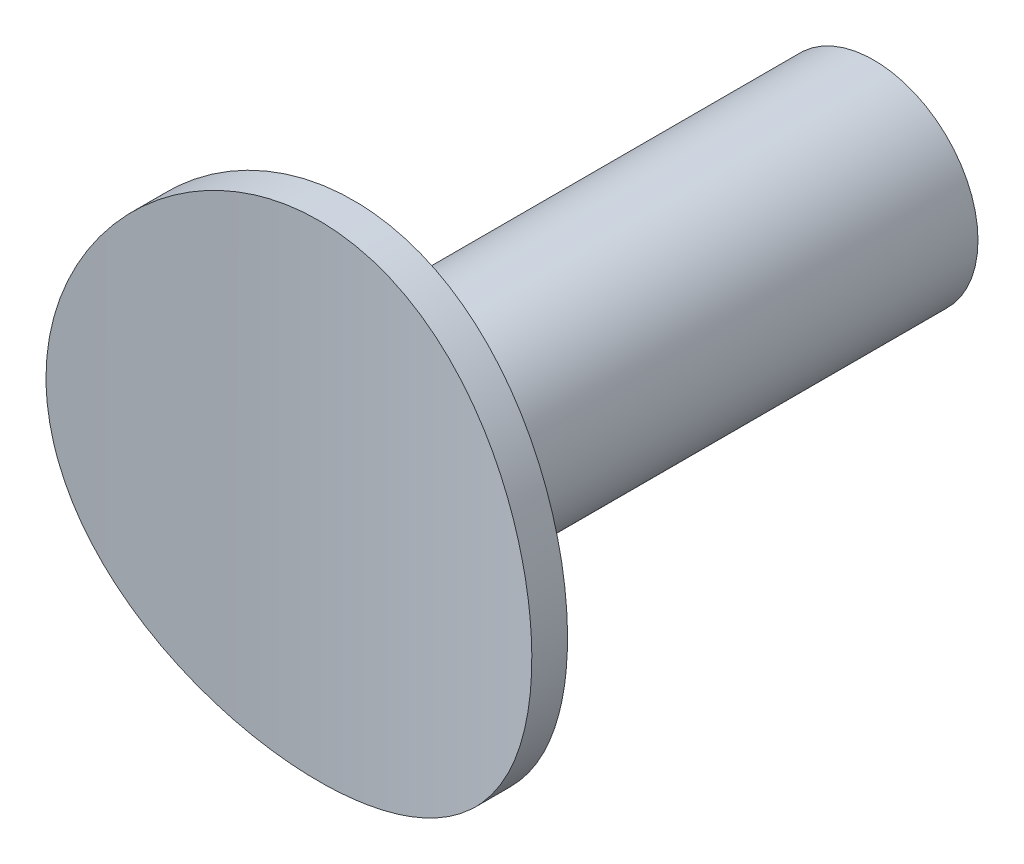
ISO-10303-21;
HEADER;
FILE_DESCRIPTION(('STEP AP214'),'2;1');
FILE_NAME('part.step','',(''),(''),'','','');
FILE_SCHEMA(('AUTOMOTIVE_DESIGN { 1 0 10303 214 1 1 1 1 }'));
ENDSEC;
DATA;
#1=APPLICATION_CONTEXT('core data for automotive mechanical design processes');
#2=APPLICATION_PROTOCOL_DEFINITION('international standard','automotive_design',2000,#1);
#3=PRODUCT_CONTEXT('',#1,'mechanical');
#4=PRODUCT('Part','Part','',(#3));
#5=PRODUCT_RELATED_PRODUCT_CATEGORY('part','',(#4));
#6=PRODUCT_DEFINITION_FORMATION('','',#4);
#7=PRODUCT_DEFINITION_CONTEXT('part definition',#1,'design');
#8=PRODUCT_DEFINITION('design','',#6,#7);
#9=PRODUCT_DEFINITION_SHAPE('','',#8);
#10=(LENGTH_UNIT() NAMED_UNIT(*) SI_UNIT(.MILLI.,.METRE.));
#11=(NAMED_UNIT(*) PLANE_ANGLE_UNIT() SI_UNIT($,.RADIAN.));
#12=(NAMED_UNIT(*) SI_UNIT($,.STERADIAN.) SOLID_ANGLE_UNIT());
#13=UNCERTAINTY_MEASURE_WITH_UNIT(LENGTH_MEASURE(1.E-05),#10,'distance_accuracy_value','');
#14=(GEOMETRIC_REPRESENTATION_CONTEXT(3) GLOBAL_UNCERTAINTY_ASSIGNED_CONTEXT((#13)) GLOBAL_UNIT_ASSIGNED_CONTEXT((#10,
#11,#12)) REPRESENTATION_CONTEXT('',''));
#15=CARTESIAN_POINT('',(0.,0.,0.));
#16=DIRECTION('',(0.,0.,1.));
#17=DIRECTION('',(1.,0.,0.));
#18=AXIS2_PLACEMENT_3D('',#15,#16,#17);
#19=CARTESIAN_POINT('',(0.,0.,5.));
#20=DIRECTION('',(0.,0.,-1.));
#21=DIRECTION('',(-1.,0.,0.));
#22=AXIS2_PLACEMENT_3D('',#19,#20,#21);
#23=CYLINDRICAL_SURFACE('',#22,3.5);
#24=CARTESIAN_POINT('',(-3.5,0.,0.41404785418518));
#25=CARTESIAN_POINT('',(-3.49999382242972,-0.193703175243394,0.414043982129636));
#26=CARTESIAN_POINT('',(-3.48386486905519,-0.387477829788261,0.410147172153116));
#27=CARTESIAN_POINT('',(-3.41986023845863,-0.769492219654667,0.3950145924914));
#28=CARTESIAN_POINT('',(-3.37196364396502,-0.957728222730468,0.38377398738779));
#29=CARTESIAN_POINT('',(-3.24603407819027,-1.32308439711535,0.35529461552767));
#30=CARTESIAN_POINT('',(-3.16803679347527,-1.50021744380222,0.338062953994301));
#31=CARTESIAN_POINT('',(-2.98422520148826,-1.83889506487007,0.299551714595636));
#32=CARTESIAN_POINT('',(-2.87841066441535,-2.00043951045709,0.278272103290254));
#33=CARTESIAN_POINT('',(-2.63980106057307,-2.30645615781757,0.23360584171042));
#34=CARTESIAN_POINT('',(-2.5065715318374,-2.45058527508346,0.210189145596052));
#35=CARTESIAN_POINT('',(-2.21785084526522,-2.71466720697627,0.164149119889418));
#36=CARTESIAN_POINT('',(-2.06235780629929,-2.83461797661763,0.141525857538709));
#37=CARTESIAN_POINT('',(-1.73120086211389,-3.04831649272867,0.0992921045962102));
#38=CARTESIAN_POINT('',(-1.55531645782126,-3.14173104353059,0.0797212067824029));
#39=CARTESIAN_POINT('',(-1.18981102664572,-3.29754493265482,0.0461382178763421));
#40=CARTESIAN_POINT('',(-1.00019176216939,-3.35994824217594,0.0321254150789096));
#41=CARTESIAN_POINT('',(-0.616171057371638,-3.45088017519229,0.0114498389382332));
#42=CARTESIAN_POINT('',(-0.421914232090605,-3.47999038454816,0.00466102373046354));
#43=CARTESIAN_POINT('',(-0.0311635768581278,-3.50533140486736,-0.00123950369547249));
#44=CARTESIAN_POINT('',(0.165329960094939,-3.50156647392213,-0.000352210147496445));
#45=CARTESIAN_POINT('',(0.550956085082925,-3.46169054018308,0.00890430562141952));
#46=CARTESIAN_POINT('',(0.740157536209716,-3.42620679922486,0.0171284305545406));
#47=CARTESIAN_POINT('',(1.10984337835129,-3.32490396988305,0.0399676250616005));
#48=CARTESIAN_POINT('',(1.29032734098614,-3.25908339241059,0.0545830083497573));
#49=CARTESIAN_POINT('',(1.63915602843674,-3.09844204447942,0.0887907638637174));
#50=CARTESIAN_POINT('',(1.80739027310239,-3.0033901148032,0.108422588551156));
#51=CARTESIAN_POINT('',(2.12574510859739,-2.78715787938144,0.1505208382788));
#52=CARTESIAN_POINT('',(2.27586291268992,-2.66597356182649,0.17298769832993));
#53=CARTESIAN_POINT('',(2.55745955163835,-2.3975246703536,0.218922079024754));
#54=CARTESIAN_POINT('',(2.68841397339774,-2.24971136633832,0.242400699940919));
#55=CARTESIAN_POINT('',(2.9237828774077,-1.93397678024096,0.287220162264489));
#56=CARTESIAN_POINT('',(3.02819642430487,-1.76605478979535,0.308560928313567));
#57=CARTESIAN_POINT('',(3.20779820165087,-1.41394072993024,0.346722827487907));
#58=CARTESIAN_POINT('',(3.2828751789352,-1.22968991412938,0.363526682268938));
#59=CARTESIAN_POINT('',(3.40083499129253,-0.850699079901447,0.390481823953275));
#60=CARTESIAN_POINT('',(3.44372372349243,-0.655960989831458,0.400634329390127));
#61=CARTESIAN_POINT('',(3.49525081184908,-0.266347711845827,0.412885367717083));
#62=CARTESIAN_POINT('',(3.50465806822764,-0.0715797756669479,0.415164671488916));
#63=CARTESIAN_POINT('',(3.49104744238815,0.316741782572008,0.411900878770518));
#64=CARTESIAN_POINT('',(3.46803212363167,0.510295499417961,0.406358400702331));
#65=CARTESIAN_POINT('',(3.39090009352541,0.88793757381852,0.388247405884228));
#66=CARTESIAN_POINT('',(3.33721769411786,1.07211978765985,0.375777069037391));
#67=CARTESIAN_POINT('',(3.20075064839175,1.42887400571391,0.345306113698783));
#68=CARTESIAN_POINT('',(3.11796290841877,1.60144477340299,0.327304907347463));
#69=CARTESIAN_POINT('',(2.92397968889597,1.93337355364668,0.287410828560261));
#70=CARTESIAN_POINT('',(2.81231684244289,2.09245081803794,0.265455929516374));
#71=CARTESIAN_POINT('',(2.56435525461255,2.38989200280703,0.220286547025187));
#72=CARTESIAN_POINT('',(2.42805300928301,2.52825297201143,0.197071884756828));
#73=CARTESIAN_POINT('',(2.13117978140588,2.78337703063407,0.151395192675249));
#74=CARTESIAN_POINT('',(1.97015041019719,2.89961238200704,0.128960038978583));
#75=CARTESIAN_POINT('',(1.63040748924498,3.10338543687699,0.0878906509418267));
#76=CARTESIAN_POINT('',(1.45169481920304,3.19092456700849,0.0692562276655821));
#77=CARTESIAN_POINT('',(1.0828393129744,3.33411479680315,0.0379998565010875));
#78=CARTESIAN_POINT('',(0.892784039390126,3.38998216657693,0.0253372327229985));
#79=CARTESIAN_POINT('',(0.505652963162882,3.46890797358145,0.00727425966111515));
#80=CARTESIAN_POINT('',(0.308578336126193,3.49197187852105,0.00187270010531618));
#81=CARTESIAN_POINT('',(-0.0820115860349006,3.504362084857,-0.00101749677922848));
#82=CARTESIAN_POINT('',(-0.275501067194068,3.4944720408113,0.00131006070559404));
#83=CARTESIAN_POINT('',(-0.657979203055063,3.44300693826575,0.0132165465634454));
#84=CARTESIAN_POINT('',(-0.846967961271833,3.40143260921981,0.0227953079950379));
#85=CARTESIAN_POINT('',(-1.21437646370029,3.28817572935145,0.0481074875871416));
#86=CARTESIAN_POINT('',(-1.39283664433181,3.21661826826587,0.0638153167425139));
#87=CARTESIAN_POINT('',(-1.73531470417867,3.04554343063893,0.0997192565707047));
#88=CARTESIAN_POINT('',(-1.89933097923893,2.94602295362676,0.11991586489645));
#89=CARTESIAN_POINT('',(-2.21204108372942,2.71936637824269,0.163142299014843));
#90=CARTESIAN_POINT('',(-2.3603346174186,2.59168772678443,0.186223266444465));
#91=CARTESIAN_POINT('',(-2.63365825928883,2.31341524362604,0.232363055875124));
#92=CARTESIAN_POINT('',(-2.75868263628052,2.16281578309344,0.255421871032461));
#93=CARTESIAN_POINT('',(-2.98382614360097,1.84013342099422,0.29931370106953));
#94=CARTESIAN_POINT('',(-3.08352384318794,1.66775058251451,0.320106127927998));
#95=CARTESIAN_POINT('',(-3.25237429886375,1.30821897658358,0.356585828158854));
#96=CARTESIAN_POINT('',(-3.32155129875168,1.12108206866762,0.37227715092297));
#97=CARTESIAN_POINT('',(-3.41596104650187,0.778312499116097,0.394076526855135));
#98=CARTESIAN_POINT('',(-3.44741160495044,0.624446939336433,0.401513150936484));
#99=CARTESIAN_POINT('',(-3.4894329209735,0.313736424177428,0.411500227666915));
#100=CARTESIAN_POINT('',(-3.50000500357955,0.15689165850828,0.414050990391984));
#101=CARTESIAN_POINT('',(-3.5,0.,0.41404785418518));
#102=B_SPLINE_CURVE_WITH_KNOTS('',3,(#24,#25,#26,#27,#28,#29,#30,#31,#32,#33,#34,#35,#36,#37,
#38,#39,#40,#41,#42,#43,#44,#45,#46,#47,#48,#49,#50,#51,#52,#53,#54,#55,#56,#57,#58,#59,#60,#61,
#62,#63,#64,#65,#66,#67,#68,#69,#70,#71,#72,#73,#74,#75,#76,#77,#78,#79,#80,#81,#82,#83,#84,#85,
#86,#87,#88,#89,#90,#91,#92,#93,#94,#95,#96,#97,#98,#99,#100,#101),.UNSPECIFIED.,.T.,.F.,(4,2,2,
2,2,2,2,2,2,2,2,2,2,2,2,2,2,2,2,2,2,2,2,2,2,2,2,2,2,2,2,2,2,2,2,2,2,2,4),(0.,0.580534028047367,
1.16145068630173,1.7416807308075,2.32191556879798,2.91217274679719,3.50247982735418,
4.09990075926493,4.69724516766548,5.28398725759893,5.87065335198108,6.44596825784345,
7.02131140614541,7.6013267010958,8.18143110269398,8.7752467963137,9.36908341428311,
9.96515067766247,10.5611087103916,11.1432889870275,11.7254232366897,12.2995106495196,
12.873659101501,13.457755844909,14.0419357177594,14.6386632899224,15.2353611912345,
15.8279338940698,16.4204078148129,16.9988940378553,17.5773669430563,18.1534501158965,
18.7295971886526,19.3180036695811,19.9065548836924,20.5043382085165,21.1016458317047,
21.5718845218039,22.0420933677167),.UNSPECIFIED.);
#103=CARTESIAN_POINT('',(-3.5,0.,0.41404785418518));
#104=VERTEX_POINT('',#103);
#105=EDGE_CURVE('E48',#104,#104,#102,.T.);
#106=ORIENTED_EDGE('',*,*,#105,.T.);
#107=EDGE_LOOP('',(#106));
#108=FACE_BOUND('',#107,.T.);
#109=CARTESIAN_POINT('',(-3.5,0.,0.928752720529712));
#110=CARTESIAN_POINT('',(-3.49999413694145,0.193498421710932,0.928748918188319));
#111=CARTESIAN_POINT('',(-3.48389894229743,0.387063246154586,0.924717872371037));
#112=CARTESIAN_POINT('',(-3.42003668396971,0.768649918290121,0.909067031868162));
#113=CARTESIAN_POINT('',(-3.37224991312957,0.95666824089992,0.897442515310323));
#114=CARTESIAN_POINT('',(-3.24662852060923,1.3215873063297,0.867996245675417));
#115=CARTESIAN_POINT('',(-3.16883099860247,1.49850146352165,0.8501821469279));
#116=CARTESIAN_POINT('',(-2.98550768701878,1.8367819342362,0.810373339348634));
#117=CARTESIAN_POINT('',(-2.87998121480662,1.99814786485666,0.788378527599185));
#118=CARTESIAN_POINT('',(-2.64188298014033,2.3040641608245,0.742181377447717));
#119=CARTESIAN_POINT('',(-2.5088472260194,2.44824843694406,0.717945741366869));
#120=CARTESIAN_POINT('',(-2.22050691723983,2.71248885421881,0.670287284339465));
#121=CARTESIAN_POINT('',(-2.06520038869463,2.83254285440992,0.646864535668927));
#122=CARTESIAN_POINT('',(-1.73423435730235,3.04659839036825,0.603104176056988));
#123=CARTESIAN_POINT('',(-1.5583373409135,3.14024243511929,0.582810442948704));
#124=CARTESIAN_POINT('',(-1.19272833877705,3.29649879239701,0.547973467096956));
#125=CARTESIAN_POINT('',(-1.00301825339325,3.35911536438024,0.533429435089039));
#126=CARTESIAN_POINT('',(-0.618982166671364,3.45037278765043,0.511965945849957));
#127=CARTESIAN_POINT('',(-0.42481167309159,3.47963475423051,0.504907279184238));
#128=CARTESIAN_POINT('',(-0.034197977416351,3.50529975825923,0.498725532026864));
#129=CARTESIAN_POINT('',(0.162244906812022,3.50170733724525,0.499601354732381));
#130=CARTESIAN_POINT('',(0.547526837878682,3.46221684477034,0.509085479165884));
#131=CARTESIAN_POINT('',(0.73643911228541,3.42698892001993,0.517533371918848));
#132=CARTESIAN_POINT('',(1.10558776040644,3.32630190749381,0.541026840005663));
#133=CARTESIAN_POINT('',(1.28582369000925,3.26084127402539,0.556072752671224));
#134=CARTESIAN_POINT('',(1.63429615823629,3.10099044603332,0.591320730184213));
#135=CARTESIAN_POINT('',(1.80241672841903,3.00635732414394,0.611565844526481));
#136=CARTESIAN_POINT('',(2.12062893064901,2.79103111903333,0.655009145976016));
#137=CARTESIAN_POINT('',(2.27071761180542,2.67033377945941,0.678207815152002));
#138=CARTESIAN_POINT('',(2.55259968378838,2.40269623162053,0.725715100536893));
#139=CARTESIAN_POINT('',(2.68383504384309,2.25517004423965,0.750036951388395));
#140=CARTESIAN_POINT('',(2.91982220763147,1.93994919220983,0.796509384348165));
#141=CARTESIAN_POINT('',(3.02457293939139,1.77225371160762,0.818659878547872));
#142=CARTESIAN_POINT('',(3.20494237115899,1.4204159577292,0.858325813269879));
#143=CARTESIAN_POINT('',(3.28043514544128,1.23620670325527,0.875821118969236));
#144=CARTESIAN_POINT('',(3.39921258452892,0.857189152909004,0.903932491257948));
#145=CARTESIAN_POINT('',(3.44250361582305,0.662382960295905,0.914549917594037));
#146=CARTESIAN_POINT('',(3.49474040218257,0.272854632622547,0.927420223051927));
#147=CARTESIAN_POINT('',(3.50450761687567,0.078249135252938,0.9298731175915));
#148=CARTESIAN_POINT('',(3.49166128716305,-0.309810503373919,0.926679675887842));
#149=CARTESIAN_POINT('',(3.46905050058773,-0.503264741281617,0.921034029446306));
#150=CARTESIAN_POINT('',(3.39280820009506,-0.880535563121871,0.902470509484665));
#151=CARTESIAN_POINT('',(3.3396474281972,-1.06445322620614,0.889663070323313));
#152=CARTESIAN_POINT('',(3.20433255960174,-1.42076827733734,0.858322382768752));
#153=CARTESIAN_POINT('',(3.12217521078625,-1.5931643705994,0.839788492153091));
#154=CARTESIAN_POINT('',(2.9294541336202,-1.92504463512417,0.798656822270354));
#155=CARTESIAN_POINT('',(2.81839497451389,-2.08423242915746,0.775990466538605));
#156=CARTESIAN_POINT('',(2.57165547940668,-2.38201388149855,0.729319570189428));
#157=CARTESIAN_POINT('',(2.43597138365251,-2.52060438911224,0.705314825614083));
#158=CARTESIAN_POINT('',(2.1400785787774,-2.77654449989219,0.657999324387837));
#159=CARTESIAN_POINT('',(1.97937488123175,-2.89332816331799,0.634717494260325));
#160=CARTESIAN_POINT('',(1.64015812817983,-3.09824765566363,0.592048749222079));
#161=CARTESIAN_POINT('',(1.4616459823487,-3.18638494689345,0.572661635517246));
#162=CARTESIAN_POINT('',(1.0930888032127,-3.33077181637991,0.540086290512352));
#163=CARTESIAN_POINT('',(0.903135156006157,-3.38724445094077,0.526854812435067));
#164=CARTESIAN_POINT('',(0.516074906556284,-3.46737755205586,0.507892852800675));
#165=CARTESIAN_POINT('',(0.318969591814965,-3.49104389488686,0.502161027912858));
#166=CARTESIAN_POINT('',(-0.0714667426602958,-3.50458094104554,0.498894743116513));
#167=CARTESIAN_POINT('',(-0.264767468399046,-3.49528951544351,0.501157046328758));
#168=CARTESIAN_POINT('',(-0.646966159162133,-3.44508092081386,0.513178534971702));
#169=CARTESIAN_POINT('',(-0.835864239113983,-3.40416457828382,0.522937524481111));
#170=CARTESIAN_POINT('',(-1.20308388524941,-3.29230398946477,0.54882901774667));
#171=CARTESIAN_POINT('',(-1.38145104192736,-3.22150196354489,0.564931311000822));
#172=CARTESIAN_POINT('',(-1.72387326595524,-3.05201068453373,0.601807323694431));
#173=CARTESIAN_POINT('',(-1.88792663699343,-2.95331813202425,0.622581595764361));
#174=CARTESIAN_POINT('',(-2.20107130198917,-2.72824101669016,0.667139589305572));
#175=CARTESIAN_POINT('',(-2.3497414212303,-2.60128181207947,0.690980643294232));
#176=CARTESIAN_POINT('',(-2.62395162871004,-2.32440366796606,0.738713487364957));
#177=CARTESIAN_POINT('',(-2.74948594020972,-2.17447901132539,0.762605288615778));
#178=CARTESIAN_POINT('',(-2.97595545371281,-1.85284416203634,0.808196237126886));
#179=CARTESIAN_POINT('',(-3.0764340209693,-1.6808056900158,0.829850978539888));
#180=CARTESIAN_POINT('',(-3.24689197964738,-1.32178458636393,0.867930942333845));
#181=CARTESIAN_POINT('',(-3.31689463076116,-1.1348134809933,0.884360150333655));
#182=CARTESIAN_POINT('',(-3.4133842337329,-0.790008194772492,0.907423240154852));
#183=CARTESIAN_POINT('',(-3.44579689552769,-0.633893048004906,0.915363726476114));
#184=CARTESIAN_POINT('',(-3.48910640386524,-0.31853344713031,0.926029840718004));
#185=CARTESIAN_POINT('',(-3.50000482650986,-0.159289223118215,0.928755850643132));
#186=CARTESIAN_POINT('',(-3.5,0.,0.928752720529712));
#187=B_SPLINE_CURVE_WITH_KNOTS('',3,(#109,#110,#111,#112,#113,#114,#115,#116,#117,#118,#119,
#120,#121,#122,#123,#124,#125,#126,#127,#128,#129,#130,#131,#132,#133,#134,#135,#136,#137,#138,
#139,#140,#141,#142,#143,#144,#145,#146,#147,#148,#149,#150,#151,#152,#153,#154,#155,#156,#157,
#158,#159,#160,#161,#162,#163,#164,#165,#166,#167,#168,#169,#170,#171,#172,#173,#174,#175,#176,
#177,#178,#179,#180,#181,#182,#183,#184,#185,#186),.UNSPECIFIED.,.T.,.F.,(4,2,2,2,2,2,2,2,2,2,2,
2,2,2,2,2,2,2,2,2,2,2,2,2,2,2,2,2,2,2,2,2,2,2,2,2,2,2,4),(0.,0.579910662310582,1.16018227604366,
1.73973883761787,2.31930966813493,2.90959680465703,3.49993629143889,4.09792023419334,
4.69582206285548,5.2823981706336,5.86889319587616,6.44324993489442,7.01763604201647,
7.59694068828999,8.17634000811419,8.77037775371276,9.36443953933004,9.96103049069178,
10.5575034608667,11.1392520172242,11.7209510254821,12.2939182418609,12.8669497399439,
13.4505378540978,14.0342151459852,14.631403280501,15.2285609255936,15.8214573754773,
16.4142476117708,16.9920768052511,17.5698908980344,18.144985742545,18.720148648634,
19.3082906940494,19.8965793932435,20.4949132180544,21.0927895812046,21.5702109780157,
22.047597398332),.UNSPECIFIED.);
#188=CARTESIAN_POINT('',(-3.5,0.,0.928752720529712));
#189=VERTEX_POINT('',#188);
#190=EDGE_CURVE('E10',#189,#189,#187,.T.);
#191=ORIENTED_EDGE('',*,*,#190,.T.);
#192=EDGE_LOOP('',(#191));
#193=FACE_BOUND('',#192,.T.);
#194=ADVANCED_FACE('F37',(#108,#193),#23,.T.);
#195=CARTESIAN_POINT('',(0.,-3.5,15.));
#196=DIRECTION('',(0.,1.,0.));
#197=DIRECTION('',(0.,0.,1.));
#198=AXIS2_PLACEMENT_3D('',#195,#196,#197);
#199=CYLINDRICAL_SURFACE('',#198,14.5);
#200=ORIENTED_EDGE('',*,*,#190,.F.);
#201=EDGE_LOOP('',(#200));
#202=FACE_BOUND('',#201,.T.);
#203=ADVANCED_FACE('F70',(#202),#199,.F.);
#204=CARTESIAN_POINT('',(0.,-3.5,15.));
#205=DIRECTION('',(0.,1.,0.));
#206=DIRECTION('',(0.,0.,1.));
#207=AXIS2_PLACEMENT_3D('',#204,#205,#206);
#208=CYLINDRICAL_SURFACE('',#207,15.);
#209=CARTESIAN_POINT('',(-1.5,0.,0.0751884434007002));
#210=CARTESIAN_POINT('',(-1.49999636009027,-0.0840293462604038,0.0751874580464571));
#211=CARTESIAN_POINT('',(-1.49291528847371,-0.168114252617759,0.0744711450867265));
#212=CARTESIAN_POINT('',(-1.46477447214534,-0.333952779440304,0.0716836866282155));
#213=CARTESIAN_POINT('',(-1.44369932232965,-0.415703727056235,0.0696110480817132));
#214=CARTESIAN_POINT('',(-1.38819017410339,-0.574448728826858,0.0643480042891905));
#215=CARTESIAN_POINT('',(-1.35376427444085,-0.65144563408716,0.0611582767981553));
#216=CARTESIAN_POINT('',(-1.27254640108665,-0.798551688437624,0.0540212914226938));
#217=CARTESIAN_POINT('',(-1.22575688343889,-0.868662201725577,0.0500741840350655));
#218=CARTESIAN_POINT('',(-1.12095714299806,-1.00027689548625,0.041851099351521));
#219=CARTESIAN_POINT('',(-1.06291112716239,-1.06175251425567,0.0375740999210096));
#220=CARTESIAN_POINT('',(-0.937322572979346,-1.17410641350535,0.0291824214642177));
#221=CARTESIAN_POINT('',(-0.869779600359852,-1.22498420910947,0.0250677498718082));
#222=CARTESIAN_POINT('',(-0.72693954247648,-1.31479688551073,0.0174542526659295));
#223=CARTESIAN_POINT('',(-0.651626493794353,-1.3537064981905,0.0139567365802963));
#224=CARTESIAN_POINT('',(-0.495494976431265,-1.41831664972302,0.00798274686344266));
#225=CARTESIAN_POINT('',(-0.414676642002328,-1.4440175105542,0.00550624834404365));
#226=CARTESIAN_POINT('',(-0.250117174114424,-1.48139686402987,0.00186050143461372));
#227=CARTESIAN_POINT('',(-0.166386790547372,-1.49312224912492,0.000686882357748402));
#228=CARTESIAN_POINT('',(0.00186111103341485,-1.50236290370058,-0.000235733980387786));
#229=CARTESIAN_POINT('',(0.0863786085816921,-1.49987854161941,1.52318209117684E-05));
#230=CARTESIAN_POINT('',(0.25348326609684,-1.48080829102477,0.00190993033221825));
#231=CARTESIAN_POINT('',(0.336076244902469,-1.46427282665416,0.00354868272431139));
#232=CARTESIAN_POINT('',(0.4973087692568,-1.41764830658007,0.008029061026047));
#233=CARTESIAN_POINT('',(0.575948263436593,-1.38755907481864,0.0108707025607019));
#234=CARTESIAN_POINT('',(0.727200472019379,-1.31462585511834,0.0174459377412699));
#235=CARTESIAN_POINT('',(0.799802356472475,-1.27175955370476,0.0211810895136341));
#236=CARTESIAN_POINT('',(0.936800269761291,-1.17450521499545,0.0291242322088892));
#237=CARTESIAN_POINT('',(1.00119605784124,-1.12011683978223,0.0333322369978356));
#238=CARTESIAN_POINT('',(1.12024915773403,-1.00107865572953,0.0417705979822296));
#239=CARTESIAN_POINT('',(1.17486261928552,-0.936384982887636,0.0460009714045877));
#240=CARTESIAN_POINT('',(1.27246130303688,-0.798724702183835,0.0539889010766672));
#241=CARTESIAN_POINT('',(1.31544650836933,-0.725758082321787,0.0577464566405362));
#242=CARTESIAN_POINT('',(1.38856827685984,-0.573589462200315,0.0643636572877625));
#243=CARTESIAN_POINT('',(1.41870213085944,-0.494386151365668,0.0672231130116833));
#244=CARTESIAN_POINT('',(1.46523110345638,-0.332009093077968,0.0717164719359346));
#245=CARTESIAN_POINT('',(1.48162664061455,-0.248835466668834,0.0733504124734773));
#246=CARTESIAN_POINT('',(1.50015716308794,-0.0812637307057385,0.0752012920887477));
#247=CARTESIAN_POINT('',(1.50235349497082,0.00312753039724972,0.0754243267859522));
#248=CARTESIAN_POINT('',(1.49258437030704,0.171076898734295,0.0744442296784313));
#249=CARTESIAN_POINT('',(1.48061910511463,0.254635017210551,0.0732411171440829));
#250=CARTESIAN_POINT('',(1.44291776176128,0.418367373417512,0.0695498336639752));
#251=CARTESIAN_POINT('',(1.41721069078336,0.498548356641988,0.067064369979819));
#252=CARTESIAN_POINT('',(1.35278507951391,0.653460077595457,0.0610906344180817));
#253=CARTESIAN_POINT('',(1.31406624117538,0.728190690430773,0.057602339569957));
#254=CARTESIAN_POINT('',(1.22456250213483,0.870359961043163,0.0500012346642961));
#255=CARTESIAN_POINT('',(1.17373694976104,0.93777291294938,0.045886337779925));
#256=CARTESIAN_POINT('',(1.06152080017676,1.0631325799111,0.0375025106222085));
#257=CARTESIAN_POINT('',(1.0001299413722,1.12107906051011,0.0332335765370134));
#258=CARTESIAN_POINT('',(0.868259706339712,1.22607245009714,0.0250042822604753));
#259=CARTESIAN_POINT('',(0.797748383954178,1.27307933937933,0.0210450891678858));
#260=CARTESIAN_POINT('',(0.649796576125697,1.35458380275962,0.0138983684005444));
#261=CARTESIAN_POINT('',(0.572356185644439,1.38908154826066,0.0107108301526131));
#262=CARTESIAN_POINT('',(0.412884189649224,1.444520651483,0.0054718437899147));
#263=CARTESIAN_POINT('',(0.330861056474941,1.46548618098782,0.00341837091527053));
#264=CARTESIAN_POINT('',(0.16443722097552,1.49334460436977,0.000670580795264844));
#265=CARTESIAN_POINT('',(0.0800365855383277,1.50023789375106,-2.37746484417245E-05));
#266=CARTESIAN_POINT('',(-0.0883533361136186,1.49975060034009,2.49253009583873E-05));
#267=CARTESIAN_POINT('',(-0.172342810836791,1.49243214474501,0.000761724349958595));
#268=CARTESIAN_POINT('',(-0.337892832534543,1.46385938151454,0.00357759633613863));
#269=CARTESIAN_POINT('',(-0.419453377602547,1.44260506294055,0.00565667032690126));
#270=CARTESIAN_POINT('',(-0.577829863151614,1.3867811139106,0.0109241427905781));
#271=CARTESIAN_POINT('',(-0.654646449116292,1.35221329959876,0.0141123899512664));
#272=CARTESIAN_POINT('',(-0.801396900232193,1.27075024662453,0.0212428137555627));
#273=CARTESIAN_POINT('',(-0.871330805652837,1.22385508009332,0.025184985987683));
#274=CARTESIAN_POINT('',(-1.00264908664041,1.11883557146437,0.033402229964177));
#275=CARTESIAN_POINT('',(-1.06399638932901,1.0606649756328,0.0376786280895123));
#276=CARTESIAN_POINT('',(-1.17608663908971,0.934836972681828,0.0460711384551216));
#277=CARTESIAN_POINT('',(-1.22682703777177,0.867177292246385,0.0501872119833466));
#278=CARTESIAN_POINT('',(-1.31636496063608,0.724103487120135,0.0578042488409898));
#279=CARTESIAN_POINT('',(-1.35513178199225,0.648670078013921,0.0613036211204099));
#280=CARTESIAN_POINT('',(-1.41939706214815,0.492377563130651,0.0672720785630743));
#281=CARTESIAN_POINT('',(-1.44491048683479,0.411524694111429,0.0697423251996114));
#282=CARTESIAN_POINT('',(-1.47558253250029,0.275178388651328,0.0727498869278255));
#283=CARTESIAN_POINT('',(-1.48472656859734,0.220556623040357,0.0736600209645898));
#284=CARTESIAN_POINT('',(-1.49693648790767,0.110631265436168,0.0748796223350529));
#285=CARTESIAN_POINT('',(-1.5000023966359,0.0553276763061095,0.0751890921902366));
#286=CARTESIAN_POINT('',(-1.5,0.,0.0751884434007002));
#287=B_SPLINE_CURVE_WITH_KNOTS('',3,(#209,#210,#211,#212,#213,#214,#215,#216,#217,#218,#219,
#220,#221,#222,#223,#224,#225,#226,#227,#228,#229,#230,#231,#232,#233,#234,#235,#236,#237,#238,
#239,#240,#241,#242,#243,#244,#245,#246,#247,#248,#249,#250,#251,#252,#253,#254,#255,#256,#257,
#258,#259,#260,#261,#262,#263,#264,#265,#266,#267,#268,#269,#270,#271,#272,#273,#274,#275,#276,
#277,#278,#279,#280,#281,#282,#283,#284,#285,#286),.UNSPECIFIED.,.T.,.F.,(4,2,2,2,2,2,2,2,2,2,2,
2,2,2,2,2,2,2,2,2,2,2,2,2,2,2,2,2,2,2,2,2,2,2,2,2,2,2,4),(0.,0.251885991654693,
0.504049727732655,0.756060736496211,1.00802172063197,1.26079742294888,1.51358468782879,
1.76690204956938,2.02021323611692,2.27267206347674,2.52512434497348,2.77667447727992,
3.02822787721461,3.2802231819962,3.53222587827793,3.78533137627502,4.03843724141344,
4.291596436769,4.54474791892549,4.79680494461648,5.04885856450305,5.3003822205679,
5.55191163841571,5.80429784717577,6.05669030584804,6.30999205227177,6.56329032777007,
6.81613489041542,7.06897234669724,7.32070700202724,7.57244185494987,7.82414237992869,
8.07584143216198,8.32859572556982,8.58141067551787,8.83486861605714,9.08803972341001,
9.25389041409069,9.41974040855723),.UNSPECIFIED.);
#288=CARTESIAN_POINT('',(-1.5,0.,0.0751884434007002));
#289=VERTEX_POINT('',#288);
#290=EDGE_CURVE('E58',#289,#289,#287,.T.);
#291=ORIENTED_EDGE('',*,*,#290,.T.);
#292=EDGE_LOOP('',(#291));
#293=FACE_BOUND('',#292,.T.);
#294=ORIENTED_EDGE('',*,*,#105,.F.);
#295=EDGE_LOOP('',(#294));
#296=FACE_BOUND('',#295,.T.);
#297=ADVANCED_FACE('F65',(#293,#296),#208,.T.);
#298=CARTESIAN_POINT('',(0.,0.,-7.5));
#299=DIRECTION('',(0.,0.,1.));
#300=DIRECTION('',(1.,0.,0.));
#301=AXIS2_PLACEMENT_3D('',#298,#299,#300);
#302=CYLINDRICAL_SURFACE('',#301,1.5);
#303=CARTESIAN_POINT('',(0.,0.,-7.5));
#304=DIRECTION('',(0.,0.,1.));
#305=DIRECTION('',(1.,0.,0.));
#306=AXIS2_PLACEMENT_3D('',#303,#304,#305);
#307=CIRCLE('',#306,1.5);
#308=CARTESIAN_POINT('',(1.5,0.,-7.5));
#309=VERTEX_POINT('',#308);
#310=EDGE_CURVE('E53',#309,#309,#307,.T.);
#311=ORIENTED_EDGE('',*,*,#310,.T.);
#312=EDGE_LOOP('',(#311));
#313=FACE_BOUND('',#312,.T.);
#314=ORIENTED_EDGE('',*,*,#290,.F.);
#315=EDGE_LOOP('',(#314));
#316=FACE_BOUND('',#315,.T.);
#317=ADVANCED_FACE('F69',(#313,#316),#302,.T.);
#318=CARTESIAN_POINT('',(0.,0.,-7.5));
#319=DIRECTION('',(0.,0.,1.));
#320=DIRECTION('',(1.,0.,0.));
#321=AXIS2_PLACEMENT_3D('',#318,#319,#320);
#322=PLANE('',#321);
#323=ORIENTED_EDGE('',*,*,#310,.F.);
#324=EDGE_LOOP('',(#323));
#325=FACE_BOUND('',#324,.T.);
#326=ADVANCED_FACE('F100',(#325),#322,.F.);
#327=CLOSED_SHELL('',(#194,#203,#297,#317,#326));
#328=MANIFOLD_SOLID_BREP('B2',#327);
#329=ADVANCED_BREP_SHAPE_REPRESENTATION('',(#18,#328),#14);
#330=SHAPE_DEFINITION_REPRESENTATION(#9,#329);
ENDSEC;
END-ISO-10303-21;
